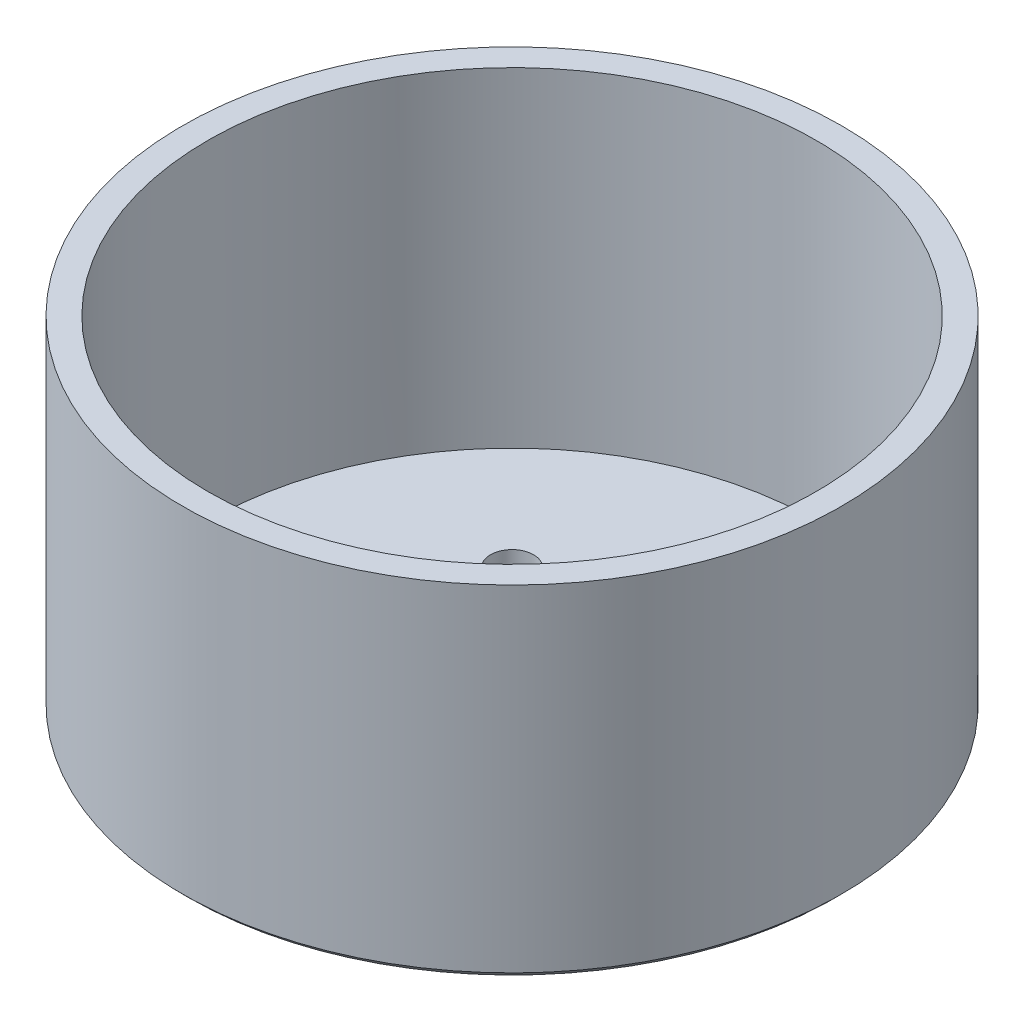
ISO-10303-21;
HEADER;
FILE_DESCRIPTION(('STEP AP214'),'2;1');
FILE_NAME('part.step','',(''),(''),'','','');
FILE_SCHEMA(('AUTOMOTIVE_DESIGN { 1 0 10303 214 1 1 1 1 }'));
ENDSEC;
DATA;
#1=APPLICATION_CONTEXT('core data for automotive mechanical design processes');
#2=APPLICATION_PROTOCOL_DEFINITION('international standard','automotive_design',2000,#1);
#3=PRODUCT_CONTEXT('',#1,'mechanical');
#4=PRODUCT('Part','Part','',(#3));
#5=PRODUCT_RELATED_PRODUCT_CATEGORY('part','',(#4));
#6=PRODUCT_DEFINITION_FORMATION('','',#4);
#7=PRODUCT_DEFINITION_CONTEXT('part definition',#1,'design');
#8=PRODUCT_DEFINITION('design','',#6,#7);
#9=PRODUCT_DEFINITION_SHAPE('','',#8);
#10=(LENGTH_UNIT() NAMED_UNIT(*) SI_UNIT(.MILLI.,.METRE.));
#11=(NAMED_UNIT(*) PLANE_ANGLE_UNIT() SI_UNIT($,.RADIAN.));
#12=(NAMED_UNIT(*) SI_UNIT($,.STERADIAN.) SOLID_ANGLE_UNIT());
#13=UNCERTAINTY_MEASURE_WITH_UNIT(LENGTH_MEASURE(1.E-05),#10,'distance_accuracy_value','');
#14=(GEOMETRIC_REPRESENTATION_CONTEXT(3) GLOBAL_UNCERTAINTY_ASSIGNED_CONTEXT((#13)) GLOBAL_UNIT_ASSIGNED_CONTEXT((#10,
#11,#12)) REPRESENTATION_CONTEXT('',''));
#15=CARTESIAN_POINT('',(0.,0.,0.));
#16=DIRECTION('',(0.,0.,1.));
#17=DIRECTION('',(1.,0.,0.));
#18=AXIS2_PLACEMENT_3D('',#15,#16,#17);
#19=CARTESIAN_POINT('',(0.,0.,0.));
#20=DIRECTION('',(0.,-1.,0.));
#21=DIRECTION('',(0.,0.,-1.));
#22=AXIS2_PLACEMENT_3D('',#19,#20,#21);
#23=PLANE('',#22);
#24=CARTESIAN_POINT('',(-8.83883476483184,0.,8.83883476483184));
#25=DIRECTION('',(0.,-1.,0.));
#26=DIRECTION('',(0.,0.,-1.));
#27=AXIS2_PLACEMENT_3D('',#24,#25,#26);
#28=CIRCLE('',#27,1.7);
#29=CARTESIAN_POINT('',(-8.83883476483184,0.,7.13883476483184));
#30=VERTEX_POINT('',#29);
#31=EDGE_CURVE('E199',#30,#30,#28,.T.);
#32=ORIENTED_EDGE('',*,*,#31,.T.);
#33=EDGE_LOOP('',(#32));
#34=FACE_BOUND('',#33,.T.);
#35=CARTESIAN_POINT('',(8.83883476483184,0.,8.83883476483185));
#36=DIRECTION('',(0.,-1.,0.));
#37=DIRECTION('',(0.,0.,-1.));
#38=AXIS2_PLACEMENT_3D('',#35,#36,#37);
#39=CIRCLE('',#38,1.7);
#40=CARTESIAN_POINT('',(8.83883476483184,0.,7.13883476483185));
#41=VERTEX_POINT('',#40);
#42=EDGE_CURVE('E193',#41,#41,#39,.T.);
#43=ORIENTED_EDGE('',*,*,#42,.T.);
#44=EDGE_LOOP('',(#43));
#45=FACE_BOUND('',#44,.T.);
#46=CARTESIAN_POINT('',(8.83883476483185,0.,-8.83883476483184));
#47=DIRECTION('',(0.,-1.,0.));
#48=DIRECTION('',(0.,0.,-1.));
#49=AXIS2_PLACEMENT_3D('',#46,#47,#48);
#50=CIRCLE('',#49,1.7);
#51=CARTESIAN_POINT('',(8.83883476483185,0.,-10.5388347648318));
#52=VERTEX_POINT('',#51);
#53=EDGE_CURVE('E187',#52,#52,#50,.T.);
#54=ORIENTED_EDGE('',*,*,#53,.T.);
#55=EDGE_LOOP('',(#54));
#56=FACE_BOUND('',#55,.T.);
#57=CARTESIAN_POINT('',(-8.83883476483184,0.,-8.83883476483184));
#58=DIRECTION('',(0.,-1.,0.));
#59=DIRECTION('',(0.,0.,-1.));
#60=AXIS2_PLACEMENT_3D('',#57,#58,#59);
#61=CIRCLE('',#60,1.7);
#62=CARTESIAN_POINT('',(-8.83883476483184,0.,-10.5388347648318));
#63=VERTEX_POINT('',#62);
#64=EDGE_CURVE('E181',#63,#63,#61,.T.);
#65=ORIENTED_EDGE('',*,*,#64,.T.);
#66=EDGE_LOOP('',(#65));
#67=FACE_BOUND('',#66,.T.);
#68=CARTESIAN_POINT('',(0.,0.,0.));
#69=DIRECTION('',(0.,-1.,0.));
#70=DIRECTION('',(0.,0.,-1.));
#71=AXIS2_PLACEMENT_3D('',#68,#69,#70);
#72=CIRCLE('',#71,7.);
#73=CARTESIAN_POINT('',(0.,0.,-7.));
#74=VERTEX_POINT('',#73);
#75=EDGE_CURVE('E175',#74,#74,#72,.F.);
#76=ORIENTED_EDGE('',*,*,#75,.F.);
#77=EDGE_LOOP('',(#76));
#78=FACE_BOUND('',#77,.T.);
#79=DIRECTION('',(0.,0.,1.));
#80=VECTOR('',#79,1.);
#81=CARTESIAN_POINT('',(15.,0.,-18.7349939951952));
#82=LINE('',#81,#80);
#83=CARTESIAN_POINT('',(15.,0.,-6.24499799839841));
#84=VERTEX_POINT('',#83);
#85=CARTESIAN_POINT('',(15.,0.,6.24499799839841));
#86=VERTEX_POINT('',#85);
#87=EDGE_CURVE('E116',#84,#86,#82,.T.);
#88=ORIENTED_EDGE('',*,*,#87,.F.);
#89=CARTESIAN_POINT('',(19.,0.,-6.24499799839841));
#90=DIRECTION('',(0.,-1.,0.));
#91=DIRECTION('',(0.,0.,-1.));
#92=AXIS2_PLACEMENT_3D('',#89,#90,#91);
#93=CIRCLE('',#92,4.);
#94=CARTESIAN_POINT('',(22.8,0.,-7.49399759807809));
#95=VERTEX_POINT('',#94);
#96=EDGE_CURVE('E127',#84,#95,#93,.T.);
#97=ORIENTED_EDGE('',*,*,#96,.T.);
#98=CARTESIAN_POINT('',(0.,0.,0.));
#99=DIRECTION('',(0.,1.,0.));
#100=DIRECTION('',(0.,0.,1.));
#101=AXIS2_PLACEMENT_3D('',#98,#99,#100);
#102=CIRCLE('',#101,24.);
#103=CARTESIAN_POINT('',(22.8,0.,7.49399759807809));
#104=VERTEX_POINT('',#103);
#105=EDGE_CURVE('E149',#95,#104,#102,.T.);
#106=ORIENTED_EDGE('',*,*,#105,.T.);
#107=CARTESIAN_POINT('',(19.,0.,6.24499799839841));
#108=DIRECTION('',(0.,-1.,0.));
#109=DIRECTION('',(0.,0.,-1.));
#110=AXIS2_PLACEMENT_3D('',#107,#108,#109);
#111=CIRCLE('',#110,4.);
#112=EDGE_CURVE('E58',#104,#86,#111,.T.);
#113=ORIENTED_EDGE('',*,*,#112,.T.);
#114=EDGE_LOOP('',(#88,#97,#106,#113));
#115=FACE_BOUND('',#114,.T.);
#116=ADVANCED_FACE('F35',(#34,#45,#56,#67,#78,#115),#23,.F.);
#117=CARTESIAN_POINT('',(0.,26.,0.));
#118=DIRECTION('',(0.,1.,0.));
#119=DIRECTION('',(0.,0.,1.));
#120=AXIS2_PLACEMENT_3D('',#117,#118,#119);
#121=PLANE('',#120);
#122=CARTESIAN_POINT('',(0.,26.,0.));
#123=DIRECTION('',(0.,1.,0.));
#124=DIRECTION('',(0.,0.,1.));
#125=AXIS2_PLACEMENT_3D('',#122,#123,#124);
#126=CIRCLE('',#125,26.);
#127=CARTESIAN_POINT('',(0.,26.,-26.));
#128=VERTEX_POINT('',#127);
#129=EDGE_CURVE('E156',#128,#128,#126,.T.);
#130=ORIENTED_EDGE('',*,*,#129,.T.);
#131=EDGE_LOOP('',(#130));
#132=FACE_BOUND('',#131,.T.);
#133=CARTESIAN_POINT('',(0.,26.,0.));
#134=DIRECTION('',(0.,1.,0.));
#135=DIRECTION('',(0.,0.,1.));
#136=AXIS2_PLACEMENT_3D('',#133,#134,#135);
#137=CIRCLE('',#136,24.);
#138=CARTESIAN_POINT('',(0.,26.,24.));
#139=VERTEX_POINT('',#138);
#140=EDGE_CURVE('E153',#139,#139,#137,.T.);
#141=ORIENTED_EDGE('',*,*,#140,.F.);
#142=EDGE_LOOP('',(#141));
#143=FACE_BOUND('',#142,.T.);
#144=ADVANCED_FACE('F227',(#132,#143),#121,.T.);
#145=CARTESIAN_POINT('',(0.,26.,0.));
#146=DIRECTION('',(0.,-1.,0.));
#147=DIRECTION('',(0.,0.,-1.));
#148=AXIS2_PLACEMENT_3D('',#145,#146,#147);
#149=CYLINDRICAL_SURFACE('',#148,26.);
#150=CARTESIAN_POINT('',(0.,-0.500000000000021,0.));
#151=DIRECTION('',(0.,-1.,0.));
#152=DIRECTION('',(0.,0.,-1.));
#153=AXIS2_PLACEMENT_3D('',#150,#151,#152);
#154=CIRCLE('',#153,26.);
#155=CARTESIAN_POINT('',(0.,-0.500000000000021,-26.));
#156=VERTEX_POINT('',#155);
#157=EDGE_CURVE('E11',#156,#156,#154,.F.);
#158=CARTESIAN_POINT('',(0.,-0.500000000000021,-26.));
#159=CARTESIAN_POINT('',(0.,-0.223958333333355,-26.));
#160=CARTESIAN_POINT('',(0.,0.0520833333333114,-26.));
#161=CARTESIAN_POINT('',(0.,0.604166666666645,-26.));
#162=CARTESIAN_POINT('',(0.,0.880208333333313,-26.));
#163=CARTESIAN_POINT('',(0.,1.43229166666665,-26.));
#164=CARTESIAN_POINT('',(0.,1.70833333333332,-26.));
#165=CARTESIAN_POINT('',(0.,2.26041666666665,-26.));
#166=CARTESIAN_POINT('',(0.,2.53645833333332,-26.));
#167=CARTESIAN_POINT('',(0.,3.08854166666665,-26.));
#168=CARTESIAN_POINT('',(0.,3.36458333333331,-26.));
#169=CARTESIAN_POINT('',(0.,3.91666666666665,-26.));
#170=CARTESIAN_POINT('',(0.,4.19270833333332,-26.));
#171=CARTESIAN_POINT('',(0.,4.74479166666665,-26.));
#172=CARTESIAN_POINT('',(0.,5.02083333333332,-26.));
#173=CARTESIAN_POINT('',(0.,5.57291666666665,-26.));
#174=CARTESIAN_POINT('',(0.,5.84895833333332,-26.));
#175=CARTESIAN_POINT('',(0.,6.40104166666665,-26.));
#176=CARTESIAN_POINT('',(0.,6.67708333333332,-26.));
#177=CARTESIAN_POINT('',(0.,7.22916666666665,-26.));
#178=CARTESIAN_POINT('',(0.,7.50520833333332,-26.));
#179=CARTESIAN_POINT('',(0.,8.05729166666665,-26.));
#180=CARTESIAN_POINT('',(0.,8.33333333333332,-26.));
#181=CARTESIAN_POINT('',(0.,8.88541666666665,-26.));
#182=CARTESIAN_POINT('',(0.,9.16145833333332,-26.));
#183=CARTESIAN_POINT('',(0.,9.71354166666665,-26.));
#184=CARTESIAN_POINT('',(0.,9.98958333333332,-26.));
#185=CARTESIAN_POINT('',(0.,10.5416666666667,-26.));
#186=CARTESIAN_POINT('',(0.,10.8177083333333,-26.));
#187=CARTESIAN_POINT('',(0.,11.3697916666667,-26.));
#188=CARTESIAN_POINT('',(0.,11.6458333333333,-26.));
#189=CARTESIAN_POINT('',(0.,12.1979166666667,-26.));
#190=CARTESIAN_POINT('',(0.,12.4739583333333,-26.));
#191=CARTESIAN_POINT('',(0.,13.0260416666667,-26.));
#192=CARTESIAN_POINT('',(0.,13.3020833333333,-26.));
#193=CARTESIAN_POINT('',(0.,13.8541666666667,-26.));
#194=CARTESIAN_POINT('',(0.,14.1302083333333,-26.));
#195=CARTESIAN_POINT('',(0.,14.6822916666667,-26.));
#196=CARTESIAN_POINT('',(0.,14.9583333333333,-26.));
#197=CARTESIAN_POINT('',(0.,15.5104166666667,-26.));
#198=CARTESIAN_POINT('',(0.,15.7864583333333,-26.));
#199=CARTESIAN_POINT('',(0.,16.3385416666667,-26.));
#200=CARTESIAN_POINT('',(0.,16.6145833333333,-26.));
#201=CARTESIAN_POINT('',(0.,17.1666666666667,-26.));
#202=CARTESIAN_POINT('',(0.,17.4427083333333,-26.));
#203=CARTESIAN_POINT('',(0.,17.9947916666667,-26.));
#204=CARTESIAN_POINT('',(0.,18.2708333333333,-26.));
#205=CARTESIAN_POINT('',(0.,18.8229166666667,-26.));
#206=CARTESIAN_POINT('',(0.,19.0989583333333,-26.));
#207=CARTESIAN_POINT('',(0.,19.6510416666667,-26.));
#208=CARTESIAN_POINT('',(0.,19.9270833333333,-26.));
#209=CARTESIAN_POINT('',(0.,20.4791666666667,-26.));
#210=CARTESIAN_POINT('',(0.,20.7552083333333,-26.));
#211=CARTESIAN_POINT('',(0.,21.3072916666667,-26.));
#212=CARTESIAN_POINT('',(0.,21.5833333333333,-26.));
#213=CARTESIAN_POINT('',(0.,22.1354166666667,-26.));
#214=CARTESIAN_POINT('',(0.,22.4114583333333,-26.));
#215=CARTESIAN_POINT('',(0.,22.9635416666667,-26.));
#216=CARTESIAN_POINT('',(0.,23.2395833333333,-26.));
#217=CARTESIAN_POINT('',(0.,23.7916666666667,-26.));
#218=CARTESIAN_POINT('',(0.,24.0677083333333,-26.));
#219=CARTESIAN_POINT('',(0.,24.6197916666667,-26.));
#220=CARTESIAN_POINT('',(0.,24.8958333333333,-26.));
#221=CARTESIAN_POINT('',(0.,25.4479166666667,-26.));
#222=CARTESIAN_POINT('',(0.,25.7239583333333,-26.));
#223=CARTESIAN_POINT('',(0.,26.,-26.));
#224=B_SPLINE_CURVE_WITH_KNOTS('',3,(#158,#159,#160,#161,#162,#163,#164,#165,#166,#167,#168,
#169,#170,#171,#172,#173,#174,#175,#176,#177,#178,#179,#180,#181,#182,#183,#184,#185,#186,#187,
#188,#189,#190,#191,#192,#193,#194,#195,#196,#197,#198,#199,#200,#201,#202,#203,#204,#205,#206,
#207,#208,#209,#210,#211,#212,#213,#214,#215,#216,#217,#218,#219,#220,#221,#222,#223),
.UNSPECIFIED.,.F.,.F.,(4,2,2,2,2,2,2,2,2,2,2,2,2,2,2,2,2,2,2,2,2,2,2,2,2,2,2,2,2,2,2,2,4),(0.,
0.828124999999999,1.65625,2.484375,3.3125,4.140625,4.96875,5.79687500000001,6.62500000000001,
7.45312500000001,8.28125000000001,9.10937500000001,9.93750000000001,10.765625,11.59375,
12.421875,13.25,14.078125,14.90625,15.734375,16.5625,17.390625,18.21875,19.046875,19.875,
20.703125,21.53125,22.359375,23.1875,24.015625,24.84375,25.671875,26.5),.UNSPECIFIED.);
#225=EDGE_CURVE('BSEAM233',#156,#128,#224,.T.);
#226=ORIENTED_EDGE('',*,*,#157,.T.);
#227=ORIENTED_EDGE('',*,*,#129,.F.);
#228=ORIENTED_EDGE('',*,*,#225,.T.);
#229=ORIENTED_EDGE('',*,*,#225,.F.);
#230=EDGE_LOOP('',(#226,#228,#227,#229));
#231=FACE_BOUND('',#230,.T.);
#232=ADVANCED_FACE('F233',(#231),#149,.T.);
#233=CARTESIAN_POINT('',(0.,26.,0.));
#234=DIRECTION('',(0.,-1.,0.));
#235=DIRECTION('',(0.,0.,-1.));
#236=AXIS2_PLACEMENT_3D('',#233,#234,#235);
#237=CYLINDRICAL_SURFACE('',#236,24.);
#238=ORIENTED_EDGE('',*,*,#140,.T.);
#239=EDGE_LOOP('',(#238));
#240=FACE_BOUND('',#239,.T.);
#241=CARTESIAN_POINT('',(0.,-1.,0.));
#242=DIRECTION('',(0.,-1.,0.));
#243=DIRECTION('',(0.,0.,-1.));
#244=AXIS2_PLACEMENT_3D('',#241,#242,#243);
#245=CIRCLE('',#244,24.);
#246=CARTESIAN_POINT('',(22.8,-1.,7.49399759807809));
#247=VERTEX_POINT('',#246);
#248=CARTESIAN_POINT('',(22.8,-1.,-7.49399759807809));
#249=VERTEX_POINT('',#248);
#250=EDGE_CURVE('E113',#247,#249,#245,.F.);
#251=ORIENTED_EDGE('',*,*,#250,.F.);
#252=DIRECTION('',(0.,-1.,0.));
#253=VECTOR('',#252,1.);
#254=CARTESIAN_POINT('',(22.8,26.,7.49399759807809));
#255=LINE('',#254,#253);
#256=EDGE_CURVE('E146',#247,#104,#255,.F.);
#257=ORIENTED_EDGE('',*,*,#256,.T.);
#258=ORIENTED_EDGE('',*,*,#105,.F.);
#259=DIRECTION('',(0.,-1.,0.));
#260=VECTOR('',#259,1.);
#261=CARTESIAN_POINT('',(22.8,26.,-7.49399759807809));
#262=LINE('',#261,#260);
#263=EDGE_CURVE('E159',#95,#249,#262,.T.);
#264=ORIENTED_EDGE('',*,*,#263,.T.);
#265=EDGE_LOOP('',(#251,#257,#258,#264));
#266=FACE_BOUND('',#265,.T.);
#267=ADVANCED_FACE('F166',(#240,#266),#237,.F.);
#268=CARTESIAN_POINT('',(0.,-1.,0.));
#269=DIRECTION('',(0.,-1.,0.));
#270=DIRECTION('',(0.,0.,-1.));
#271=AXIS2_PLACEMENT_3D('',#268,#269,#270);
#272=PLANE('',#271);
#273=CARTESIAN_POINT('',(0.,-1.,0.));
#274=DIRECTION('',(0.,-1.,0.));
#275=DIRECTION('',(0.,0.,-1.));
#276=AXIS2_PLACEMENT_3D('',#273,#274,#275);
#277=CIRCLE('',#276,25.5);
#278=CARTESIAN_POINT('',(0.,-1.,-25.5));
#279=VERTEX_POINT('',#278);
#280=EDGE_CURVE('E43',#279,#279,#277,.T.);
#281=ORIENTED_EDGE('',*,*,#280,.T.);
#282=EDGE_LOOP('',(#281));
#283=FACE_BOUND('',#282,.T.);
#284=CARTESIAN_POINT('',(0.,-1.,0.));
#285=DIRECTION('',(0.,-1.,0.));
#286=DIRECTION('',(0.,0.,-1.));
#287=AXIS2_PLACEMENT_3D('',#284,#285,#286);
#288=CIRCLE('',#287,21.9);
#289=CARTESIAN_POINT('',(19.3646865711987,-1.,10.2283387702616));
#290=VERTEX_POINT('',#289);
#291=CARTESIAN_POINT('',(19.3646865711987,-1.,-10.2283387702616));
#292=VERTEX_POINT('',#291);
#293=EDGE_CURVE('E50',#290,#292,#288,.T.);
#294=ORIENTED_EDGE('',*,*,#293,.F.);
#295=CARTESIAN_POINT('',(19.,-1.,6.24499799839841));
#296=DIRECTION('',(0.,-1.,0.));
#297=DIRECTION('',(0.,0.,-1.));
#298=AXIS2_PLACEMENT_3D('',#295,#296,#297);
#299=CIRCLE('',#298,4.);
#300=EDGE_CURVE('E112',#290,#247,#299,.F.);
#301=ORIENTED_EDGE('',*,*,#300,.T.);
#302=ORIENTED_EDGE('',*,*,#250,.T.);
#303=CARTESIAN_POINT('',(19.,-1.,-6.24499799839841));
#304=DIRECTION('',(0.,-1.,0.));
#305=DIRECTION('',(0.,0.,-1.));
#306=AXIS2_PLACEMENT_3D('',#303,#304,#305);
#307=CIRCLE('',#306,4.);
#308=EDGE_CURVE('E124',#249,#292,#307,.F.);
#309=ORIENTED_EDGE('',*,*,#308,.T.);
#310=EDGE_LOOP('',(#294,#301,#302,#309));
#311=FACE_BOUND('',#310,.T.);
#312=ADVANCED_FACE('F239',(#283,#311),#272,.T.);
#313=CARTESIAN_POINT('',(15.,-1.001,-18.7349939951952));
#314=DIRECTION('',(-1.,0.,0.));
#315=DIRECTION('',(0.,0.,1.));
#316=AXIS2_PLACEMENT_3D('',#313,#314,#315);
#317=PLANE('',#316);
#318=ORIENTED_EDGE('',*,*,#87,.T.);
#319=DIRECTION('',(0.,-1.,0.));
#320=VECTOR('',#319,1.);
#321=CARTESIAN_POINT('',(15.,-1.001,6.24499799839841));
#322=LINE('',#321,#320);
#323=CARTESIAN_POINT('',(15.,-1.7,6.24499799839841));
#324=VERTEX_POINT('',#323);
#325=EDGE_CURVE('E141',#86,#324,#322,.T.);
#326=ORIENTED_EDGE('',*,*,#325,.T.);
#327=DIRECTION('',(0.,0.,1.));
#328=VECTOR('',#327,1.);
#329=CARTESIAN_POINT('',(15.,-1.7,-6.24499799839841));
#330=LINE('',#329,#328);
#331=CARTESIAN_POINT('',(15.,-1.7,-6.24499799839841));
#332=VERTEX_POINT('',#331);
#333=EDGE_CURVE('E106',#332,#324,#330,.T.);
#334=ORIENTED_EDGE('',*,*,#333,.F.);
#335=DIRECTION('',(0.,-1.,0.));
#336=VECTOR('',#335,1.);
#337=CARTESIAN_POINT('',(15.,-1.001,-6.24499799839841));
#338=LINE('',#337,#336);
#339=EDGE_CURVE('E143',#332,#84,#338,.F.);
#340=ORIENTED_EDGE('',*,*,#339,.T.);
#341=EDGE_LOOP('',(#318,#326,#334,#340));
#342=FACE_BOUND('',#341,.T.);
#343=ADVANCED_FACE('F168',(#342),#317,.F.);
#344=CARTESIAN_POINT('',(19.,26.,6.24499799839841));
#345=DIRECTION('',(0.,-1.,0.));
#346=DIRECTION('',(0.,0.,-1.));
#347=AXIS2_PLACEMENT_3D('',#344,#345,#346);
#348=CYLINDRICAL_SURFACE('',#347,4.);
#349=ORIENTED_EDGE('',*,*,#300,.F.);
#350=DIRECTION('',(0.,1.,0.));
#351=VECTOR('',#350,1.);
#352=CARTESIAN_POINT('',(19.3646865711987,-1.7,10.2283387702616));
#353=LINE('',#352,#351);
#354=CARTESIAN_POINT('',(19.3646865711987,-1.7,10.2283387702616));
#355=VERTEX_POINT('',#354);
#356=EDGE_CURVE('E93',#355,#290,#353,.T.);
#357=ORIENTED_EDGE('',*,*,#356,.F.);
#358=CARTESIAN_POINT('',(19.,-1.7,6.24499799839841));
#359=DIRECTION('',(0.,1.,0.));
#360=DIRECTION('',(0.,0.,-1.));
#361=AXIS2_PLACEMENT_3D('',#358,#359,#360);
#362=CIRCLE('',#361,4.);
#363=EDGE_CURVE('E100',#324,#355,#362,.T.);
#364=ORIENTED_EDGE('',*,*,#363,.F.);
#365=ORIENTED_EDGE('',*,*,#325,.F.);
#366=ORIENTED_EDGE('',*,*,#112,.F.);
#367=ORIENTED_EDGE('',*,*,#256,.F.);
#368=EDGE_LOOP('',(#349,#357,#364,#365,#366,#367));
#369=FACE_BOUND('',#368,.T.);
#370=ADVANCED_FACE('F110',(#369),#348,.F.);
#371=CARTESIAN_POINT('',(19.,26.,-6.24499799839841));
#372=DIRECTION('',(0.,-1.,0.));
#373=DIRECTION('',(0.,0.,-1.));
#374=AXIS2_PLACEMENT_3D('',#371,#372,#373);
#375=CYLINDRICAL_SURFACE('',#374,4.);
#376=ORIENTED_EDGE('',*,*,#308,.F.);
#377=ORIENTED_EDGE('',*,*,#263,.F.);
#378=ORIENTED_EDGE('',*,*,#96,.F.);
#379=ORIENTED_EDGE('',*,*,#339,.F.);
#380=CARTESIAN_POINT('',(19.,-1.7,-6.24499799839841));
#381=DIRECTION('',(0.,1.,0.));
#382=DIRECTION('',(0.,0.,-1.));
#383=AXIS2_PLACEMENT_3D('',#380,#381,#382);
#384=CIRCLE('',#383,4.);
#385=CARTESIAN_POINT('',(19.3646865711987,-1.7,-10.2283387702616));
#386=VERTEX_POINT('',#385);
#387=EDGE_CURVE('E99',#386,#332,#384,.T.);
#388=ORIENTED_EDGE('',*,*,#387,.F.);
#389=DIRECTION('',(0.,1.,0.));
#390=VECTOR('',#389,1.);
#391=CARTESIAN_POINT('',(19.3646865711987,-1.7,-10.2283387702616));
#392=LINE('',#391,#390);
#393=EDGE_CURVE('E95',#386,#292,#392,.T.);
#394=ORIENTED_EDGE('',*,*,#393,.T.);
#395=EDGE_LOOP('',(#376,#377,#378,#379,#388,#394));
#396=FACE_BOUND('',#395,.T.);
#397=ADVANCED_FACE('F170',(#396),#375,.F.);
#398=CARTESIAN_POINT('',(0.,-1.7,0.));
#399=DIRECTION('',(0.,1.,0.));
#400=DIRECTION('',(0.,0.,1.));
#401=AXIS2_PLACEMENT_3D('',#398,#399,#400);
#402=CYLINDRICAL_SURFACE('',#401,21.9);
#403=ORIENTED_EDGE('',*,*,#293,.T.);
#404=ORIENTED_EDGE('',*,*,#393,.F.);
#405=CARTESIAN_POINT('',(0.,-1.7,0.));
#406=DIRECTION('',(0.,-1.,0.));
#407=DIRECTION('',(0.,0.,-1.));
#408=AXIS2_PLACEMENT_3D('',#405,#406,#407);
#409=CIRCLE('',#408,21.9);
#410=EDGE_CURVE('E89',#355,#386,#409,.T.);
#411=ORIENTED_EDGE('',*,*,#410,.F.);
#412=ORIENTED_EDGE('',*,*,#356,.T.);
#413=EDGE_LOOP('',(#403,#404,#411,#412));
#414=FACE_BOUND('',#413,.T.);
#415=ADVANCED_FACE('F91',(#414),#402,.T.);
#416=CARTESIAN_POINT('',(19.,-1.7,6.24499799839841));
#417=DIRECTION('',(0.,-1.,0.));
#418=DIRECTION('',(0.,0.,-1.));
#419=AXIS2_PLACEMENT_3D('',#416,#417,#418);
#420=PLANE('',#419);
#421=CARTESIAN_POINT('',(-8.83883476483184,-1.7,8.83883476483184));
#422=DIRECTION('',(0.,-1.,0.));
#423=DIRECTION('',(0.,0.,-1.));
#424=AXIS2_PLACEMENT_3D('',#421,#422,#423);
#425=CIRCLE('',#424,1.7);
#426=CARTESIAN_POINT('',(-8.83883476483184,-1.7,7.13883476483184));
#427=VERTEX_POINT('',#426);
#428=EDGE_CURVE('E202',#427,#427,#425,.T.);
#429=ORIENTED_EDGE('',*,*,#428,.F.);
#430=EDGE_LOOP('',(#429));
#431=FACE_BOUND('',#430,.T.);
#432=CARTESIAN_POINT('',(8.83883476483184,-1.7,8.83883476483185));
#433=DIRECTION('',(0.,-1.,0.));
#434=DIRECTION('',(0.,0.,-1.));
#435=AXIS2_PLACEMENT_3D('',#432,#433,#434);
#436=CIRCLE('',#435,1.7);
#437=CARTESIAN_POINT('',(8.83883476483184,-1.7,7.13883476483185));
#438=VERTEX_POINT('',#437);
#439=EDGE_CURVE('E196',#438,#438,#436,.T.);
#440=ORIENTED_EDGE('',*,*,#439,.F.);
#441=EDGE_LOOP('',(#440));
#442=FACE_BOUND('',#441,.T.);
#443=CARTESIAN_POINT('',(8.83883476483185,-1.7,-8.83883476483184));
#444=DIRECTION('',(0.,-1.,0.));
#445=DIRECTION('',(0.,0.,-1.));
#446=AXIS2_PLACEMENT_3D('',#443,#444,#445);
#447=CIRCLE('',#446,1.7);
#448=CARTESIAN_POINT('',(8.83883476483185,-1.7,-10.5388347648318));
#449=VERTEX_POINT('',#448);
#450=EDGE_CURVE('E190',#449,#449,#447,.T.);
#451=ORIENTED_EDGE('',*,*,#450,.F.);
#452=EDGE_LOOP('',(#451));
#453=FACE_BOUND('',#452,.T.);
#454=CARTESIAN_POINT('',(-8.83883476483184,-1.7,-8.83883476483184));
#455=DIRECTION('',(0.,-1.,0.));
#456=DIRECTION('',(0.,0.,-1.));
#457=AXIS2_PLACEMENT_3D('',#454,#455,#456);
#458=CIRCLE('',#457,1.7);
#459=CARTESIAN_POINT('',(-8.83883476483184,-1.7,-10.5388347648318));
#460=VERTEX_POINT('',#459);
#461=EDGE_CURVE('E184',#460,#460,#458,.T.);
#462=ORIENTED_EDGE('',*,*,#461,.F.);
#463=EDGE_LOOP('',(#462));
#464=FACE_BOUND('',#463,.T.);
#465=CARTESIAN_POINT('',(0.,-1.7,0.));
#466=DIRECTION('',(0.,-1.,0.));
#467=DIRECTION('',(0.,0.,-1.));
#468=AXIS2_PLACEMENT_3D('',#465,#466,#467);
#469=CIRCLE('',#468,7.);
#470=CARTESIAN_POINT('',(0.,-1.7,-7.));
#471=VERTEX_POINT('',#470);
#472=EDGE_CURVE('E178',#471,#471,#469,.T.);
#473=ORIENTED_EDGE('',*,*,#472,.F.);
#474=EDGE_LOOP('',(#473));
#475=FACE_BOUND('',#474,.T.);
#476=ORIENTED_EDGE('',*,*,#363,.T.);
#477=ORIENTED_EDGE('',*,*,#410,.T.);
#478=ORIENTED_EDGE('',*,*,#387,.T.);
#479=ORIENTED_EDGE('',*,*,#333,.T.);
#480=EDGE_LOOP('',(#476,#477,#478,#479));
#481=FACE_BOUND('',#480,.T.);
#482=ADVANCED_FACE('F104',(#431,#442,#453,#464,#475,#481),#420,.T.);
#483=CARTESIAN_POINT('',(0.,26.001,0.));
#484=DIRECTION('',(0.,-1.,0.));
#485=DIRECTION('',(0.,0.,-1.));
#486=AXIS2_PLACEMENT_3D('',#483,#484,#485);
#487=CYLINDRICAL_SURFACE('',#486,7.);
#488=ORIENTED_EDGE('',*,*,#472,.T.);
#489=EDGE_LOOP('',(#488));
#490=FACE_BOUND('',#489,.T.);
#491=ORIENTED_EDGE('',*,*,#75,.T.);
#492=EDGE_LOOP('',(#491));
#493=FACE_BOUND('',#492,.T.);
#494=ADVANCED_FACE('F210',(#490,#493),#487,.F.);
#495=CARTESIAN_POINT('',(-8.83883476483184,-1.7,-8.83883476483184));
#496=DIRECTION('',(0.,-1.,0.));
#497=DIRECTION('',(0.,0.,-1.));
#498=AXIS2_PLACEMENT_3D('',#495,#496,#497);
#499=CYLINDRICAL_SURFACE('',#498,1.7);
#500=ORIENTED_EDGE('',*,*,#64,.F.);
#501=EDGE_LOOP('',(#500));
#502=FACE_BOUND('',#501,.T.);
#503=ORIENTED_EDGE('',*,*,#461,.T.);
#504=EDGE_LOOP('',(#503));
#505=FACE_BOUND('',#504,.T.);
#506=ADVANCED_FACE('F222',(#502,#505),#499,.F.);
#507=CARTESIAN_POINT('',(8.83883476483185,-1.7,-8.83883476483184));
#508=DIRECTION('',(0.,-1.,0.));
#509=DIRECTION('',(0.,0.,-1.));
#510=AXIS2_PLACEMENT_3D('',#507,#508,#509);
#511=CYLINDRICAL_SURFACE('',#510,1.7);
#512=ORIENTED_EDGE('',*,*,#53,.F.);
#513=EDGE_LOOP('',(#512));
#514=FACE_BOUND('',#513,.T.);
#515=ORIENTED_EDGE('',*,*,#450,.T.);
#516=EDGE_LOOP('',(#515));
#517=FACE_BOUND('',#516,.T.);
#518=ADVANCED_FACE('F332',(#514,#517),#511,.F.);
#519=CARTESIAN_POINT('',(8.83883476483184,-1.7,8.83883476483185));
#520=DIRECTION('',(0.,-1.,0.));
#521=DIRECTION('',(0.,0.,-1.));
#522=AXIS2_PLACEMENT_3D('',#519,#520,#521);
#523=CYLINDRICAL_SURFACE('',#522,1.7);
#524=ORIENTED_EDGE('',*,*,#42,.F.);
#525=EDGE_LOOP('',(#524));
#526=FACE_BOUND('',#525,.T.);
#527=ORIENTED_EDGE('',*,*,#439,.T.);
#528=EDGE_LOOP('',(#527));
#529=FACE_BOUND('',#528,.T.);
#530=ADVANCED_FACE('F341',(#526,#529),#523,.F.);
#531=CARTESIAN_POINT('',(-8.83883476483184,-1.7,8.83883476483184));
#532=DIRECTION('',(0.,-1.,0.));
#533=DIRECTION('',(0.,0.,-1.));
#534=AXIS2_PLACEMENT_3D('',#531,#532,#533);
#535=CYLINDRICAL_SURFACE('',#534,1.7);
#536=ORIENTED_EDGE('',*,*,#31,.F.);
#537=EDGE_LOOP('',(#536));
#538=FACE_BOUND('',#537,.T.);
#539=ORIENTED_EDGE('',*,*,#428,.T.);
#540=EDGE_LOOP('',(#539));
#541=FACE_BOUND('',#540,.T.);
#542=ADVANCED_FACE('F206',(#538,#541),#535,.F.);
#543=CARTESIAN_POINT('',(0.,-1.,0.));
#544=DIRECTION('',(0.,1.,0.));
#545=DIRECTION('',(0.,0.,1.));
#546=AXIS2_PLACEMENT_3D('',#543,#544,#545);
#547=CONICAL_SURFACE('',#546,25.5,0.785398163397455);
#548=ORIENTED_EDGE('',*,*,#157,.F.);
#549=EDGE_LOOP('',(#548));
#550=FACE_BOUND('',#549,.T.);
#551=ORIENTED_EDGE('',*,*,#280,.F.);
#552=EDGE_LOOP('',(#551));
#553=FACE_BOUND('',#552,.T.);
#554=ADVANCED_FACE('F37',(#550,#553),#547,.T.);
#555=CLOSED_SHELL('',(#116,#144,#232,#267,#312,#343,#370,#397,#415,#482,#494,#506,#518,#530,
#542,#554));
#556=MANIFOLD_SOLID_BREP('B2',#555);
#557=ADVANCED_BREP_SHAPE_REPRESENTATION('',(#18,#556),#14);
#558=SHAPE_DEFINITION_REPRESENTATION(#9,#557);
ENDSEC;
END-ISO-10303-21;
